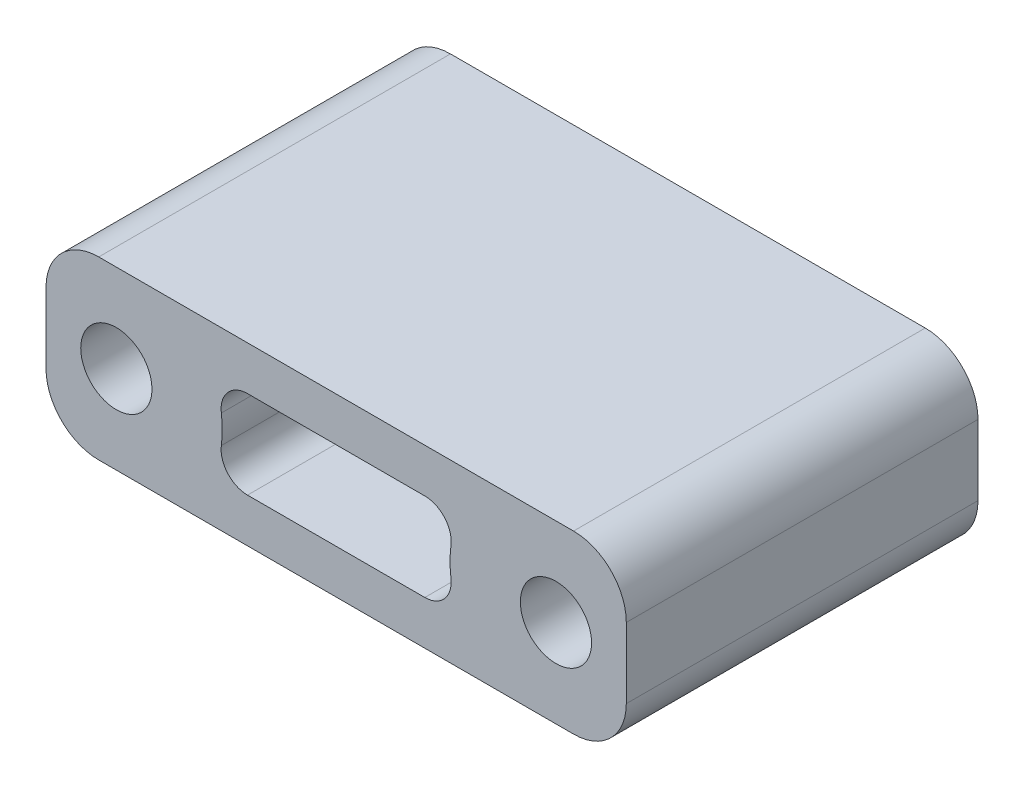
ISO-10303-21;
HEADER;
FILE_DESCRIPTION(('STEP AP214'),'2;1');
FILE_NAME('part.step','',(''),(''),'','','');
FILE_SCHEMA(('AUTOMOTIVE_DESIGN { 1 0 10303 214 1 1 1 1 }'));
ENDSEC;
DATA;
#1=APPLICATION_CONTEXT('core data for automotive mechanical design processes');
#2=APPLICATION_PROTOCOL_DEFINITION('international standard','automotive_design',2000,#1);
#3=PRODUCT_CONTEXT('',#1,'mechanical');
#4=PRODUCT('Part','Part','',(#3));
#5=PRODUCT_RELATED_PRODUCT_CATEGORY('part','',(#4));
#6=PRODUCT_DEFINITION_FORMATION('','',#4);
#7=PRODUCT_DEFINITION_CONTEXT('part definition',#1,'design');
#8=PRODUCT_DEFINITION('design','',#6,#7);
#9=PRODUCT_DEFINITION_SHAPE('','',#8);
#10=(LENGTH_UNIT() NAMED_UNIT(*) SI_UNIT(.MILLI.,.METRE.));
#11=(NAMED_UNIT(*) PLANE_ANGLE_UNIT() SI_UNIT($,.RADIAN.));
#12=(NAMED_UNIT(*) SI_UNIT($,.STERADIAN.) SOLID_ANGLE_UNIT());
#13=UNCERTAINTY_MEASURE_WITH_UNIT(LENGTH_MEASURE(1.E-05),#10,'distance_accuracy_value','');
#14=(GEOMETRIC_REPRESENTATION_CONTEXT(3) GLOBAL_UNCERTAINTY_ASSIGNED_CONTEXT((#13)) GLOBAL_UNIT_ASSIGNED_CONTEXT((#10,
#11,#12)) REPRESENTATION_CONTEXT('',''));
#15=CARTESIAN_POINT('',(0.,0.,0.));
#16=DIRECTION('',(0.,0.,1.));
#17=DIRECTION('',(1.,0.,0.));
#18=AXIS2_PLACEMENT_3D('',#15,#16,#17);
#19=CARTESIAN_POINT('',(0.,0.,10.));
#20=DIRECTION('',(0.,0.,-1.));
#21=DIRECTION('',(-1.,0.,0.));
#22=AXIS2_PLACEMENT_3D('',#19,#20,#21);
#23=PLANE('',#22);
#24=CARTESIAN_POINT('',(12.5,0.,10.));
#25=DIRECTION('',(0.,0.,-1.));
#26=DIRECTION('',(-1.,0.,0.));
#27=AXIS2_PLACEMENT_3D('',#24,#25,#26);
#28=CIRCLE('',#27,6.025);
#29=CARTESIAN_POINT('',(6.52843727022983,0.800664451827247,10.));
#30=VERTEX_POINT('',#29);
#31=CARTESIAN_POINT('',(6.52843727022983,-0.800664451827247,10.));
#32=VERTEX_POINT('',#31);
#33=EDGE_CURVE('E303',#30,#32,#28,.F.);
#34=ORIENTED_EDGE('',*,*,#33,.T.);
#35=CARTESIAN_POINT('',(5.04174115493435,-1.00000000000001,10.));
#36=DIRECTION('',(0.,0.,-1.));
#37=DIRECTION('',(-1.,0.,0.));
#38=AXIS2_PLACEMENT_3D('',#35,#36,#37);
#39=CIRCLE('',#38,1.5);
#40=CARTESIAN_POINT('',(5.04174115493435,-2.50000000000001,10.));
#41=VERTEX_POINT('',#40);
#42=EDGE_CURVE('E273',#32,#41,#39,.T.);
#43=ORIENTED_EDGE('',*,*,#42,.T.);
#44=DIRECTION('',(-1.,0.,0.));
#45=VECTOR('',#44,1.);
#46=CARTESIAN_POINT('',(0.,-2.50000000000001,10.));
#47=LINE('',#46,#45);
#48=CARTESIAN_POINT('',(-5.04174115493435,-2.50000000000001,10.));
#49=VERTEX_POINT('',#48);
#50=EDGE_CURVE('E295',#41,#49,#47,.T.);
#51=ORIENTED_EDGE('',*,*,#50,.T.);
#52=CARTESIAN_POINT('',(-5.04174115493435,-1.00000000000001,10.));
#53=DIRECTION('',(0.,0.,-1.));
#54=DIRECTION('',(-1.,0.,0.));
#55=AXIS2_PLACEMENT_3D('',#52,#53,#54);
#56=CIRCLE('',#55,1.5);
#57=CARTESIAN_POINT('',(-6.52843727022982,-0.80066445182725,10.));
#58=VERTEX_POINT('',#57);
#59=EDGE_CURVE('E277',#49,#58,#56,.T.);
#60=ORIENTED_EDGE('',*,*,#59,.T.);
#61=CARTESIAN_POINT('',(-12.5,0.,10.));
#62=DIRECTION('',(0.,0.,-1.));
#63=DIRECTION('',(-1.,0.,0.));
#64=AXIS2_PLACEMENT_3D('',#61,#62,#63);
#65=CIRCLE('',#64,6.025);
#66=CARTESIAN_POINT('',(-6.52843727022983,0.800664451827245,10.));
#67=VERTEX_POINT('',#66);
#68=EDGE_CURVE('E294',#58,#67,#65,.F.);
#69=ORIENTED_EDGE('',*,*,#68,.T.);
#70=CARTESIAN_POINT('',(-5.04174115493435,1.00000000000001,10.));
#71=DIRECTION('',(0.,0.,-1.));
#72=DIRECTION('',(-1.,0.,0.));
#73=AXIS2_PLACEMENT_3D('',#70,#71,#72);
#74=CIRCLE('',#73,1.5);
#75=CARTESIAN_POINT('',(-5.04174115493435,2.50000000000001,10.));
#76=VERTEX_POINT('',#75);
#77=EDGE_CURVE('E181',#67,#76,#74,.T.);
#78=ORIENTED_EDGE('',*,*,#77,.T.);
#79=DIRECTION('',(1.,0.,0.));
#80=VECTOR('',#79,1.);
#81=CARTESIAN_POINT('',(0.,2.50000000000001,10.));
#82=LINE('',#81,#80);
#83=CARTESIAN_POINT('',(5.04174115493435,2.50000000000001,10.));
#84=VERTEX_POINT('',#83);
#85=EDGE_CURVE('E159',#76,#84,#82,.T.);
#86=ORIENTED_EDGE('',*,*,#85,.T.);
#87=CARTESIAN_POINT('',(5.04174115493435,1.00000000000001,10.));
#88=DIRECTION('',(0.,0.,-1.));
#89=DIRECTION('',(-1.,0.,0.));
#90=AXIS2_PLACEMENT_3D('',#87,#88,#89);
#91=CIRCLE('',#90,1.5);
#92=EDGE_CURVE('E270',#84,#30,#91,.T.);
#93=ORIENTED_EDGE('',*,*,#92,.T.);
#94=EDGE_LOOP('',(#34,#43,#51,#60,#69,#78,#86,#93));
#95=FACE_BOUND('',#94,.T.);
#96=DIRECTION('',(0.,-1.,0.));
#97=VECTOR('',#96,1.);
#98=CARTESIAN_POINT('',(-16.5,-5.,10.));
#99=LINE('',#98,#97);
#100=CARTESIAN_POINT('',(-16.5,2.,10.));
#101=VERTEX_POINT('',#100);
#102=CARTESIAN_POINT('',(-16.5,-2.,10.));
#103=VERTEX_POINT('',#102);
#104=EDGE_CURVE('E315',#101,#103,#99,.T.);
#105=ORIENTED_EDGE('',*,*,#104,.T.);
#106=CARTESIAN_POINT('',(-13.5,-2.,10.));
#107=DIRECTION('',(0.,0.,-1.));
#108=DIRECTION('',(-1.,0.,0.));
#109=AXIS2_PLACEMENT_3D('',#106,#107,#108);
#110=CIRCLE('',#109,3.);
#111=CARTESIAN_POINT('',(-13.5,-5.,10.));
#112=VERTEX_POINT('',#111);
#113=EDGE_CURVE('E209',#103,#112,#110,.F.);
#114=ORIENTED_EDGE('',*,*,#113,.T.);
#115=DIRECTION('',(1.,0.,0.));
#116=VECTOR('',#115,1.);
#117=CARTESIAN_POINT('',(-16.5,-5.,10.));
#118=LINE('',#117,#116);
#119=CARTESIAN_POINT('',(13.5,-4.99999999999999,10.));
#120=VERTEX_POINT('',#119);
#121=EDGE_CURVE('E252',#112,#120,#118,.T.);
#122=ORIENTED_EDGE('',*,*,#121,.T.);
#123=CARTESIAN_POINT('',(13.5,-2.,10.));
#124=DIRECTION('',(0.,0.,-1.));
#125=DIRECTION('',(-1.,0.,0.));
#126=AXIS2_PLACEMENT_3D('',#123,#124,#125);
#127=CIRCLE('',#126,3.);
#128=CARTESIAN_POINT('',(16.5,-2.,10.));
#129=VERTEX_POINT('',#128);
#130=EDGE_CURVE('E205',#120,#129,#127,.F.);
#131=ORIENTED_EDGE('',*,*,#130,.T.);
#132=DIRECTION('',(0.,1.,0.));
#133=VECTOR('',#132,1.);
#134=CARTESIAN_POINT('',(16.5,-4.99999999999999,10.));
#135=LINE('',#134,#133);
#136=CARTESIAN_POINT('',(16.5,2.,10.));
#137=VERTEX_POINT('',#136);
#138=EDGE_CURVE('E219',#129,#137,#135,.T.);
#139=ORIENTED_EDGE('',*,*,#138,.T.);
#140=CARTESIAN_POINT('',(13.5,2.,10.));
#141=DIRECTION('',(0.,0.,-1.));
#142=DIRECTION('',(-1.,0.,0.));
#143=AXIS2_PLACEMENT_3D('',#140,#141,#142);
#144=CIRCLE('',#143,3.);
#145=CARTESIAN_POINT('',(13.5,5.00000000000001,10.));
#146=VERTEX_POINT('',#145);
#147=EDGE_CURVE('E58',#137,#146,#144,.F.);
#148=ORIENTED_EDGE('',*,*,#147,.T.);
#149=DIRECTION('',(-1.,0.,0.));
#150=VECTOR('',#149,1.);
#151=CARTESIAN_POINT('',(-16.5,5.,10.));
#152=LINE('',#151,#150);
#153=CARTESIAN_POINT('',(-13.5,5.,10.));
#154=VERTEX_POINT('',#153);
#155=EDGE_CURVE('E228',#146,#154,#152,.T.);
#156=ORIENTED_EDGE('',*,*,#155,.T.);
#157=CARTESIAN_POINT('',(-13.5,2.,10.));
#158=DIRECTION('',(0.,0.,-1.));
#159=DIRECTION('',(-1.,0.,0.));
#160=AXIS2_PLACEMENT_3D('',#157,#158,#159);
#161=CIRCLE('',#160,3.);
#162=EDGE_CURVE('E207',#154,#101,#161,.F.);
#163=ORIENTED_EDGE('',*,*,#162,.T.);
#164=EDGE_LOOP('',(#105,#114,#122,#131,#139,#148,#156,#163));
#165=FACE_BOUND('',#164,.T.);
#166=CARTESIAN_POINT('',(12.5,0.,10.));
#167=DIRECTION('',(0.,0.,1.));
#168=DIRECTION('',(1.,0.,0.));
#169=AXIS2_PLACEMENT_3D('',#166,#167,#168);
#170=CIRCLE('',#169,2.025);
#171=CARTESIAN_POINT('',(14.525,0.,10.));
#172=VERTEX_POINT('',#171);
#173=EDGE_CURVE('E243',#172,#172,#170,.T.);
#174=ORIENTED_EDGE('',*,*,#173,.F.);
#175=EDGE_LOOP('',(#174));
#176=FACE_BOUND('',#175,.T.);
#177=CARTESIAN_POINT('',(-12.5,0.,10.));
#178=DIRECTION('',(0.,0.,1.));
#179=DIRECTION('',(-1.,0.,0.));
#180=AXIS2_PLACEMENT_3D('',#177,#178,#179);
#181=CIRCLE('',#180,2.025);
#182=CARTESIAN_POINT('',(-14.525,0.,10.));
#183=VERTEX_POINT('',#182);
#184=EDGE_CURVE('E301',#183,#183,#181,.T.);
#185=ORIENTED_EDGE('',*,*,#184,.F.);
#186=EDGE_LOOP('',(#185));
#187=FACE_BOUND('',#186,.T.);
#188=ADVANCED_FACE('F36',(#95,#165,#176,#187),#23,.F.);
#189=CARTESIAN_POINT('',(0.,0.,-10.));
#190=DIRECTION('',(0.,0.,-1.));
#191=DIRECTION('',(-1.,0.,0.));
#192=AXIS2_PLACEMENT_3D('',#189,#190,#191);
#193=PLANE('',#192);
#194=CARTESIAN_POINT('',(-12.5,0.,-10.));
#195=DIRECTION('',(0.,0.,-1.));
#196=DIRECTION('',(-1.,0.,0.));
#197=AXIS2_PLACEMENT_3D('',#194,#195,#196);
#198=CIRCLE('',#197,6.025);
#199=CARTESIAN_POINT('',(-6.52843727022982,-0.80066445182725,-10.));
#200=VERTEX_POINT('',#199);
#201=CARTESIAN_POINT('',(-6.52843727022983,0.800664451827245,-10.));
#202=VERTEX_POINT('',#201);
#203=EDGE_CURVE('E163',#200,#202,#198,.F.);
#204=ORIENTED_EDGE('',*,*,#203,.F.);
#205=CARTESIAN_POINT('',(-5.04174115493435,-1.00000000000001,-10.));
#206=DIRECTION('',(0.,0.,-1.));
#207=DIRECTION('',(-1.,0.,0.));
#208=AXIS2_PLACEMENT_3D('',#205,#206,#207);
#209=CIRCLE('',#208,1.5);
#210=CARTESIAN_POINT('',(-5.04174115493435,-2.50000000000001,-10.));
#211=VERTEX_POINT('',#210);
#212=EDGE_CURVE('E185',#200,#211,#209,.F.);
#213=ORIENTED_EDGE('',*,*,#212,.T.);
#214=DIRECTION('',(-1.,0.,0.));
#215=VECTOR('',#214,1.);
#216=CARTESIAN_POINT('',(0.,-2.50000000000001,-10.));
#217=LINE('',#216,#215);
#218=CARTESIAN_POINT('',(5.04174115493435,-2.50000000000001,-10.));
#219=VERTEX_POINT('',#218);
#220=EDGE_CURVE('E249',#219,#211,#217,.T.);
#221=ORIENTED_EDGE('',*,*,#220,.F.);
#222=CARTESIAN_POINT('',(5.04174115493435,-1.00000000000001,-10.));
#223=DIRECTION('',(0.,0.,-1.));
#224=DIRECTION('',(-1.,0.,0.));
#225=AXIS2_PLACEMENT_3D('',#222,#223,#224);
#226=CIRCLE('',#225,1.5);
#227=CARTESIAN_POINT('',(6.52843727022983,-0.800664451827247,-10.));
#228=VERTEX_POINT('',#227);
#229=EDGE_CURVE('E275',#219,#228,#226,.F.);
#230=ORIENTED_EDGE('',*,*,#229,.T.);
#231=CARTESIAN_POINT('',(12.5,0.,-10.));
#232=DIRECTION('',(0.,0.,-1.));
#233=DIRECTION('',(-1.,0.,0.));
#234=AXIS2_PLACEMENT_3D('',#231,#232,#233);
#235=CIRCLE('',#234,6.025);
#236=CARTESIAN_POINT('',(6.52843727022983,0.800664451827247,-10.));
#237=VERTEX_POINT('',#236);
#238=EDGE_CURVE('E174',#237,#228,#235,.F.);
#239=ORIENTED_EDGE('',*,*,#238,.F.);
#240=CARTESIAN_POINT('',(5.04174115493435,1.00000000000001,-10.));
#241=DIRECTION('',(0.,0.,-1.));
#242=DIRECTION('',(-1.,0.,0.));
#243=AXIS2_PLACEMENT_3D('',#240,#241,#242);
#244=CIRCLE('',#243,1.5);
#245=CARTESIAN_POINT('',(5.04174115493435,2.50000000000001,-10.));
#246=VERTEX_POINT('',#245);
#247=EDGE_CURVE('E173',#237,#246,#244,.F.);
#248=ORIENTED_EDGE('',*,*,#247,.T.);
#249=DIRECTION('',(1.,0.,0.));
#250=VECTOR('',#249,1.);
#251=CARTESIAN_POINT('',(0.,2.50000000000001,-10.));
#252=LINE('',#251,#250);
#253=CARTESIAN_POINT('',(-5.04174115493435,2.50000000000001,-10.));
#254=VERTEX_POINT('',#253);
#255=EDGE_CURVE('E156',#254,#246,#252,.T.);
#256=ORIENTED_EDGE('',*,*,#255,.F.);
#257=CARTESIAN_POINT('',(-5.04174115493435,1.00000000000001,-10.));
#258=DIRECTION('',(0.,0.,-1.));
#259=DIRECTION('',(-1.,0.,0.));
#260=AXIS2_PLACEMENT_3D('',#257,#258,#259);
#261=CIRCLE('',#260,1.5);
#262=EDGE_CURVE('E169',#254,#202,#261,.F.);
#263=ORIENTED_EDGE('',*,*,#262,.T.);
#264=EDGE_LOOP('',(#204,#213,#221,#230,#239,#248,#256,#263));
#265=FACE_BOUND('',#264,.T.);
#266=CARTESIAN_POINT('',(12.5,0.,-10.));
#267=DIRECTION('',(0.,0.,1.));
#268=DIRECTION('',(1.,0.,0.));
#269=AXIS2_PLACEMENT_3D('',#266,#267,#268);
#270=CIRCLE('',#269,2.025);
#271=CARTESIAN_POINT('',(14.525,0.,-10.));
#272=VERTEX_POINT('',#271);
#273=EDGE_CURVE('E308',#272,#272,#270,.T.);
#274=ORIENTED_EDGE('',*,*,#273,.T.);
#275=EDGE_LOOP('',(#274));
#276=FACE_BOUND('',#275,.T.);
#277=DIRECTION('',(1.,0.,0.));
#278=VECTOR('',#277,1.);
#279=CARTESIAN_POINT('',(-16.5,-5.,-10.));
#280=LINE('',#279,#278);
#281=CARTESIAN_POINT('',(-13.5,-5.,-10.));
#282=VERTEX_POINT('',#281);
#283=CARTESIAN_POINT('',(13.5,-4.99999999999999,-10.));
#284=VERTEX_POINT('',#283);
#285=EDGE_CURVE('E229',#282,#284,#280,.T.);
#286=ORIENTED_EDGE('',*,*,#285,.F.);
#287=CARTESIAN_POINT('',(-13.5,-2.,-10.));
#288=DIRECTION('',(0.,0.,-1.));
#289=DIRECTION('',(-1.,0.,0.));
#290=AXIS2_PLACEMENT_3D('',#287,#288,#289);
#291=CIRCLE('',#290,3.);
#292=CARTESIAN_POINT('',(-16.5,-2.,-10.));
#293=VERTEX_POINT('',#292);
#294=EDGE_CURVE('E197',#282,#293,#291,.T.);
#295=ORIENTED_EDGE('',*,*,#294,.T.);
#296=DIRECTION('',(0.,-1.,0.));
#297=VECTOR('',#296,1.);
#298=CARTESIAN_POINT('',(-16.5,-5.,-10.));
#299=LINE('',#298,#297);
#300=CARTESIAN_POINT('',(-16.5,2.,-10.));
#301=VERTEX_POINT('',#300);
#302=EDGE_CURVE('E239',#301,#293,#299,.T.);
#303=ORIENTED_EDGE('',*,*,#302,.F.);
#304=CARTESIAN_POINT('',(-13.5,2.,-10.));
#305=DIRECTION('',(0.,0.,-1.));
#306=DIRECTION('',(-1.,0.,0.));
#307=AXIS2_PLACEMENT_3D('',#304,#305,#306);
#308=CIRCLE('',#307,3.);
#309=CARTESIAN_POINT('',(-13.5,5.,-10.));
#310=VERTEX_POINT('',#309);
#311=EDGE_CURVE('E195',#301,#310,#308,.T.);
#312=ORIENTED_EDGE('',*,*,#311,.T.);
#313=DIRECTION('',(-1.,0.,0.));
#314=VECTOR('',#313,1.);
#315=CARTESIAN_POINT('',(-16.5,5.,-10.));
#316=LINE('',#315,#314);
#317=CARTESIAN_POINT('',(13.5,5.00000000000001,-10.));
#318=VERTEX_POINT('',#317);
#319=EDGE_CURVE('E234',#318,#310,#316,.T.);
#320=ORIENTED_EDGE('',*,*,#319,.F.);
#321=CARTESIAN_POINT('',(13.5,2.,-10.));
#322=DIRECTION('',(0.,0.,-1.));
#323=DIRECTION('',(-1.,0.,0.));
#324=AXIS2_PLACEMENT_3D('',#321,#322,#323);
#325=CIRCLE('',#324,3.);
#326=CARTESIAN_POINT('',(16.5,2.,-10.));
#327=VERTEX_POINT('',#326);
#328=EDGE_CURVE('E191',#318,#327,#325,.T.);
#329=ORIENTED_EDGE('',*,*,#328,.T.);
#330=DIRECTION('',(0.,1.,0.));
#331=VECTOR('',#330,1.);
#332=CARTESIAN_POINT('',(16.5,-4.99999999999999,-10.));
#333=LINE('',#332,#331);
#334=CARTESIAN_POINT('',(16.5,-2.,-10.));
#335=VERTEX_POINT('',#334);
#336=EDGE_CURVE('E222',#335,#327,#333,.T.);
#337=ORIENTED_EDGE('',*,*,#336,.F.);
#338=CARTESIAN_POINT('',(13.5,-2.,-10.));
#339=DIRECTION('',(0.,0.,-1.));
#340=DIRECTION('',(-1.,0.,0.));
#341=AXIS2_PLACEMENT_3D('',#338,#339,#340);
#342=CIRCLE('',#341,3.);
#343=EDGE_CURVE('E193',#335,#284,#342,.T.);
#344=ORIENTED_EDGE('',*,*,#343,.T.);
#345=EDGE_LOOP('',(#286,#295,#303,#312,#320,#329,#337,#344));
#346=FACE_BOUND('',#345,.T.);
#347=CARTESIAN_POINT('',(-12.5,0.,-10.));
#348=DIRECTION('',(0.,0.,1.));
#349=DIRECTION('',(-1.,0.,0.));
#350=AXIS2_PLACEMENT_3D('',#347,#348,#349);
#351=CIRCLE('',#350,2.025);
#352=CARTESIAN_POINT('',(-14.525,0.,-10.));
#353=VERTEX_POINT('',#352);
#354=EDGE_CURVE('E298',#353,#353,#351,.T.);
#355=ORIENTED_EDGE('',*,*,#354,.T.);
#356=EDGE_LOOP('',(#355));
#357=FACE_BOUND('',#356,.T.);
#358=ADVANCED_FACE('F167',(#265,#276,#346,#357),#193,.T.);
#359=CARTESIAN_POINT('',(16.5,-4.99999999999999,10.));
#360=DIRECTION('',(-1.,0.,0.));
#361=DIRECTION('',(0.,-1.,0.));
#362=AXIS2_PLACEMENT_3D('',#359,#360,#361);
#363=PLANE('',#362);
#364=ORIENTED_EDGE('',*,*,#138,.F.);
#365=DIRECTION('',(0.,0.,-1.));
#366=VECTOR('',#365,1.);
#367=CARTESIAN_POINT('',(16.5,-2.,10.));
#368=LINE('',#367,#366);
#369=EDGE_CURVE('E11',#129,#335,#368,.T.);
#370=ORIENTED_EDGE('',*,*,#369,.T.);
#371=ORIENTED_EDGE('',*,*,#336,.T.);
#372=DIRECTION('',(0.,0.,-1.));
#373=VECTOR('',#372,1.);
#374=CARTESIAN_POINT('',(16.5,2.,10.));
#375=LINE('',#374,#373);
#376=EDGE_CURVE('E44',#327,#137,#375,.F.);
#377=ORIENTED_EDGE('',*,*,#376,.T.);
#378=EDGE_LOOP('',(#364,#370,#371,#377));
#379=FACE_BOUND('',#378,.T.);
#380=ADVANCED_FACE('F218',(#379),#363,.F.);
#381=CARTESIAN_POINT('',(-16.5,5.,10.));
#382=DIRECTION('',(0.,-1.,0.));
#383=DIRECTION('',(1.,0.,0.));
#384=AXIS2_PLACEMENT_3D('',#381,#382,#383);
#385=PLANE('',#384);
#386=ORIENTED_EDGE('',*,*,#319,.T.);
#387=DIRECTION('',(0.,0.,-1.));
#388=VECTOR('',#387,1.);
#389=CARTESIAN_POINT('',(-13.5,5.,10.));
#390=LINE('',#389,#388);
#391=EDGE_CURVE('E51',#310,#154,#390,.F.);
#392=ORIENTED_EDGE('',*,*,#391,.T.);
#393=ORIENTED_EDGE('',*,*,#155,.F.);
#394=DIRECTION('',(0.,0.,-1.));
#395=VECTOR('',#394,1.);
#396=CARTESIAN_POINT('',(13.5,5.00000000000001,10.));
#397=LINE('',#396,#395);
#398=EDGE_CURVE('E211',#146,#318,#397,.T.);
#399=ORIENTED_EDGE('',*,*,#398,.T.);
#400=EDGE_LOOP('',(#386,#392,#393,#399));
#401=FACE_BOUND('',#400,.T.);
#402=ADVANCED_FACE('F233',(#401),#385,.F.);
#403=CARTESIAN_POINT('',(-16.5,-5.,10.));
#404=DIRECTION('',(1.,0.,0.));
#405=DIRECTION('',(0.,1.,0.));
#406=AXIS2_PLACEMENT_3D('',#403,#404,#405);
#407=PLANE('',#406);
#408=ORIENTED_EDGE('',*,*,#302,.T.);
#409=DIRECTION('',(0.,0.,-1.));
#410=VECTOR('',#409,1.);
#411=CARTESIAN_POINT('',(-16.5,-2.,10.));
#412=LINE('',#411,#410);
#413=EDGE_CURVE('E202',#293,#103,#412,.F.);
#414=ORIENTED_EDGE('',*,*,#413,.T.);
#415=ORIENTED_EDGE('',*,*,#104,.F.);
#416=DIRECTION('',(0.,0.,-1.));
#417=VECTOR('',#416,1.);
#418=CARTESIAN_POINT('',(-16.5,2.,10.));
#419=LINE('',#418,#417);
#420=EDGE_CURVE('E199',#101,#301,#419,.T.);
#421=ORIENTED_EDGE('',*,*,#420,.T.);
#422=EDGE_LOOP('',(#408,#414,#415,#421));
#423=FACE_BOUND('',#422,.T.);
#424=ADVANCED_FACE('F328',(#423),#407,.F.);
#425=CARTESIAN_POINT('',(-16.5,-5.,10.));
#426=DIRECTION('',(0.,1.,0.));
#427=DIRECTION('',(-1.,0.,0.));
#428=AXIS2_PLACEMENT_3D('',#425,#426,#427);
#429=PLANE('',#428);
#430=ORIENTED_EDGE('',*,*,#121,.F.);
#431=DIRECTION('',(0.,0.,-1.));
#432=VECTOR('',#431,1.);
#433=CARTESIAN_POINT('',(-13.5,-5.,10.));
#434=LINE('',#433,#432);
#435=EDGE_CURVE('E183',#112,#282,#434,.T.);
#436=ORIENTED_EDGE('',*,*,#435,.T.);
#437=ORIENTED_EDGE('',*,*,#285,.T.);
#438=DIRECTION('',(0.,0.,-1.));
#439=VECTOR('',#438,1.);
#440=CARTESIAN_POINT('',(13.5,-4.99999999999999,10.));
#441=LINE('',#440,#439);
#442=EDGE_CURVE('E180',#284,#120,#441,.F.);
#443=ORIENTED_EDGE('',*,*,#442,.T.);
#444=EDGE_LOOP('',(#430,#436,#437,#443));
#445=FACE_BOUND('',#444,.T.);
#446=ADVANCED_FACE('F323',(#445),#429,.F.);
#447=CARTESIAN_POINT('',(12.5,0.,10.));
#448=DIRECTION('',(0.,0.,-1.));
#449=DIRECTION('',(-1.,0.,0.));
#450=AXIS2_PLACEMENT_3D('',#447,#448,#449);
#451=CYLINDRICAL_SURFACE('',#450,2.025);
#452=ORIENTED_EDGE('',*,*,#173,.T.);
#453=EDGE_LOOP('',(#452));
#454=FACE_BOUND('',#453,.T.);
#455=ORIENTED_EDGE('',*,*,#273,.F.);
#456=EDGE_LOOP('',(#455));
#457=FACE_BOUND('',#456,.T.);
#458=ADVANCED_FACE('F348',(#454,#457),#451,.F.);
#459=CARTESIAN_POINT('',(-12.5,0.,10.));
#460=DIRECTION('',(0.,0.,-1.));
#461=DIRECTION('',(-1.,0.,0.));
#462=AXIS2_PLACEMENT_3D('',#459,#460,#461);
#463=CYLINDRICAL_SURFACE('',#462,2.025);
#464=ORIENTED_EDGE('',*,*,#184,.T.);
#465=EDGE_LOOP('',(#464));
#466=FACE_BOUND('',#465,.T.);
#467=ORIENTED_EDGE('',*,*,#354,.F.);
#468=EDGE_LOOP('',(#467));
#469=FACE_BOUND('',#468,.T.);
#470=ADVANCED_FACE('F438',(#466,#469),#463,.F.);
#471=CARTESIAN_POINT('',(-12.5,0.,-15.));
#472=DIRECTION('',(0.,0.,1.));
#473=DIRECTION('',(1.,0.,0.));
#474=AXIS2_PLACEMENT_3D('',#471,#472,#473);
#475=CYLINDRICAL_SURFACE('',#474,6.025);
#476=ORIENTED_EDGE('',*,*,#68,.F.);
#477=DIRECTION('',(0.,0.,1.));
#478=VECTOR('',#477,1.);
#479=CARTESIAN_POINT('',(-6.52843727022982,-0.80066445182725,-15.));
#480=LINE('',#479,#478);
#481=EDGE_CURVE('E268',#58,#200,#480,.F.);
#482=ORIENTED_EDGE('',*,*,#481,.T.);
#483=ORIENTED_EDGE('',*,*,#203,.T.);
#484=DIRECTION('',(0.,0.,1.));
#485=VECTOR('',#484,1.);
#486=CARTESIAN_POINT('',(-6.52843727022983,0.800664451827245,-15.));
#487=LINE('',#486,#485);
#488=EDGE_CURVE('E179',#202,#67,#487,.T.);
#489=ORIENTED_EDGE('',*,*,#488,.T.);
#490=EDGE_LOOP('',(#476,#482,#483,#489));
#491=FACE_BOUND('',#490,.T.);
#492=ADVANCED_FACE('F297',(#491),#475,.T.);
#493=CARTESIAN_POINT('',(-7.01815496388305,2.50000000000001,-15.));
#494=DIRECTION('',(0.,1.,0.));
#495=DIRECTION('',(-1.,0.,0.));
#496=AXIS2_PLACEMENT_3D('',#493,#494,#495);
#497=PLANE('',#496);
#498=ORIENTED_EDGE('',*,*,#255,.T.);
#499=DIRECTION('',(0.,0.,-1.));
#500=VECTOR('',#499,1.);
#501=CARTESIAN_POINT('',(5.04174115493435,2.5,10.));
#502=LINE('',#501,#500);
#503=EDGE_CURVE('E162',#246,#84,#502,.F.);
#504=ORIENTED_EDGE('',*,*,#503,.T.);
#505=ORIENTED_EDGE('',*,*,#85,.F.);
#506=DIRECTION('',(0.,0.,-1.));
#507=VECTOR('',#506,1.);
#508=CARTESIAN_POINT('',(-5.04174115493435,2.50000000000001,-10.));
#509=LINE('',#508,#507);
#510=EDGE_CURVE('E152',#76,#254,#509,.T.);
#511=ORIENTED_EDGE('',*,*,#510,.T.);
#512=EDGE_LOOP('',(#498,#504,#505,#511));
#513=FACE_BOUND('',#512,.T.);
#514=ADVANCED_FACE('F154',(#513),#497,.F.);
#515=CARTESIAN_POINT('',(12.5,0.,-15.));
#516=DIRECTION('',(0.,0.,1.));
#517=DIRECTION('',(1.,0.,0.));
#518=AXIS2_PLACEMENT_3D('',#515,#516,#517);
#519=CYLINDRICAL_SURFACE('',#518,6.025);
#520=ORIENTED_EDGE('',*,*,#33,.F.);
#521=DIRECTION('',(0.,0.,1.));
#522=VECTOR('',#521,1.);
#523=CARTESIAN_POINT('',(6.52843727022983,0.800664451827247,-15.));
#524=LINE('',#523,#522);
#525=EDGE_CURVE('E260',#30,#237,#524,.F.);
#526=ORIENTED_EDGE('',*,*,#525,.T.);
#527=ORIENTED_EDGE('',*,*,#238,.T.);
#528=DIRECTION('',(0.,0.,1.));
#529=VECTOR('',#528,1.);
#530=CARTESIAN_POINT('',(6.52843727022983,-0.800664451827247,-15.));
#531=LINE('',#530,#529);
#532=EDGE_CURVE('E257',#228,#32,#531,.T.);
#533=ORIENTED_EDGE('',*,*,#532,.T.);
#534=EDGE_LOOP('',(#520,#526,#527,#533));
#535=FACE_BOUND('',#534,.T.);
#536=ADVANCED_FACE('F456',(#535),#519,.T.);
#537=CARTESIAN_POINT('',(-7.01815496388305,-2.50000000000001,-15.));
#538=DIRECTION('',(0.,-1.,0.));
#539=DIRECTION('',(1.,0.,0.));
#540=AXIS2_PLACEMENT_3D('',#537,#538,#539);
#541=PLANE('',#540);
#542=ORIENTED_EDGE('',*,*,#50,.F.);
#543=DIRECTION('',(0.,0.,-1.));
#544=VECTOR('',#543,1.);
#545=CARTESIAN_POINT('',(5.04174115493435,-2.5,-10.));
#546=LINE('',#545,#544);
#547=EDGE_CURVE('E265',#41,#219,#546,.T.);
#548=ORIENTED_EDGE('',*,*,#547,.T.);
#549=ORIENTED_EDGE('',*,*,#220,.T.);
#550=DIRECTION('',(0.,0.,-1.));
#551=VECTOR('',#550,1.);
#552=CARTESIAN_POINT('',(-5.04174115493435,-2.50000000000001,10.));
#553=LINE('',#552,#551);
#554=EDGE_CURVE('E262',#211,#49,#553,.F.);
#555=ORIENTED_EDGE('',*,*,#554,.T.);
#556=EDGE_LOOP('',(#542,#548,#549,#555));
#557=FACE_BOUND('',#556,.T.);
#558=ADVANCED_FACE('F286',(#557),#541,.F.);
#559=CARTESIAN_POINT('',(5.04174115493435,1.00000000000001,-15.));
#560=DIRECTION('',(0.,0.,1.));
#561=DIRECTION('',(1.,0.,0.));
#562=AXIS2_PLACEMENT_3D('',#559,#560,#561);
#563=CYLINDRICAL_SURFACE('',#562,1.5);
#564=ORIENTED_EDGE('',*,*,#247,.F.);
#565=ORIENTED_EDGE('',*,*,#525,.F.);
#566=ORIENTED_EDGE('',*,*,#92,.F.);
#567=ORIENTED_EDGE('',*,*,#503,.F.);
#568=EDGE_LOOP('',(#564,#565,#566,#567));
#569=FACE_BOUND('',#568,.T.);
#570=ADVANCED_FACE('F359',(#569),#563,.F.);
#571=CARTESIAN_POINT('',(5.04174115493435,-1.00000000000001,-15.));
#572=DIRECTION('',(0.,0.,1.));
#573=DIRECTION('',(1.,0.,0.));
#574=AXIS2_PLACEMENT_3D('',#571,#572,#573);
#575=CYLINDRICAL_SURFACE('',#574,1.5);
#576=ORIENTED_EDGE('',*,*,#229,.F.);
#577=ORIENTED_EDGE('',*,*,#547,.F.);
#578=ORIENTED_EDGE('',*,*,#42,.F.);
#579=ORIENTED_EDGE('',*,*,#532,.F.);
#580=EDGE_LOOP('',(#576,#577,#578,#579));
#581=FACE_BOUND('',#580,.T.);
#582=ADVANCED_FACE('F362',(#581),#575,.F.);
#583=CARTESIAN_POINT('',(-5.04174115493435,-1.00000000000001,-15.));
#584=DIRECTION('',(0.,0.,1.));
#585=DIRECTION('',(1.,0.,0.));
#586=AXIS2_PLACEMENT_3D('',#583,#584,#585);
#587=CYLINDRICAL_SURFACE('',#586,1.5);
#588=ORIENTED_EDGE('',*,*,#212,.F.);
#589=ORIENTED_EDGE('',*,*,#481,.F.);
#590=ORIENTED_EDGE('',*,*,#59,.F.);
#591=ORIENTED_EDGE('',*,*,#554,.F.);
#592=EDGE_LOOP('',(#588,#589,#590,#591));
#593=FACE_BOUND('',#592,.T.);
#594=ADVANCED_FACE('F289',(#593),#587,.F.);
#595=CARTESIAN_POINT('',(-5.04174115493435,1.00000000000001,-15.));
#596=DIRECTION('',(0.,0.,1.));
#597=DIRECTION('',(1.,0.,0.));
#598=AXIS2_PLACEMENT_3D('',#595,#596,#597);
#599=CYLINDRICAL_SURFACE('',#598,1.5);
#600=ORIENTED_EDGE('',*,*,#262,.F.);
#601=ORIENTED_EDGE('',*,*,#510,.F.);
#602=ORIENTED_EDGE('',*,*,#77,.F.);
#603=ORIENTED_EDGE('',*,*,#488,.F.);
#604=EDGE_LOOP('',(#600,#601,#602,#603));
#605=FACE_BOUND('',#604,.T.);
#606=ADVANCED_FACE('F177',(#605),#599,.F.);
#607=CARTESIAN_POINT('',(-13.5,-2.,10.));
#608=DIRECTION('',(0.,0.,-1.));
#609=DIRECTION('',(-1.,0.,0.));
#610=AXIS2_PLACEMENT_3D('',#607,#608,#609);
#611=CYLINDRICAL_SURFACE('',#610,3.);
#612=ORIENTED_EDGE('',*,*,#113,.F.);
#613=ORIENTED_EDGE('',*,*,#413,.F.);
#614=ORIENTED_EDGE('',*,*,#294,.F.);
#615=ORIENTED_EDGE('',*,*,#435,.F.);
#616=EDGE_LOOP('',(#612,#613,#614,#615));
#617=FACE_BOUND('',#616,.T.);
#618=ADVANCED_FACE('F325',(#617),#611,.T.);
#619=CARTESIAN_POINT('',(-13.5,2.,10.));
#620=DIRECTION('',(0.,0.,-1.));
#621=DIRECTION('',(-1.,0.,0.));
#622=AXIS2_PLACEMENT_3D('',#619,#620,#621);
#623=CYLINDRICAL_SURFACE('',#622,3.);
#624=ORIENTED_EDGE('',*,*,#162,.F.);
#625=ORIENTED_EDGE('',*,*,#391,.F.);
#626=ORIENTED_EDGE('',*,*,#311,.F.);
#627=ORIENTED_EDGE('',*,*,#420,.F.);
#628=EDGE_LOOP('',(#624,#625,#626,#627));
#629=FACE_BOUND('',#628,.T.);
#630=ADVANCED_FACE('F333',(#629),#623,.T.);
#631=CARTESIAN_POINT('',(13.5,-2.,10.));
#632=DIRECTION('',(0.,0.,-1.));
#633=DIRECTION('',(-1.,0.,0.));
#634=AXIS2_PLACEMENT_3D('',#631,#632,#633);
#635=CYLINDRICAL_SURFACE('',#634,3.);
#636=ORIENTED_EDGE('',*,*,#130,.F.);
#637=ORIENTED_EDGE('',*,*,#442,.F.);
#638=ORIENTED_EDGE('',*,*,#343,.F.);
#639=ORIENTED_EDGE('',*,*,#369,.F.);
#640=EDGE_LOOP('',(#636,#637,#638,#639));
#641=FACE_BOUND('',#640,.T.);
#642=ADVANCED_FACE('F322',(#641),#635,.T.);
#643=CARTESIAN_POINT('',(13.5,2.,10.));
#644=DIRECTION('',(0.,0.,-1.));
#645=DIRECTION('',(-1.,0.,0.));
#646=AXIS2_PLACEMENT_3D('',#643,#644,#645);
#647=CYLINDRICAL_SURFACE('',#646,3.);
#648=ORIENTED_EDGE('',*,*,#147,.F.);
#649=ORIENTED_EDGE('',*,*,#376,.F.);
#650=ORIENTED_EDGE('',*,*,#328,.F.);
#651=ORIENTED_EDGE('',*,*,#398,.F.);
#652=EDGE_LOOP('',(#648,#649,#650,#651));
#653=FACE_BOUND('',#652,.T.);
#654=ADVANCED_FACE('F38',(#653),#647,.T.);
#655=CLOSED_SHELL('',(#188,#358,#380,#402,#424,#446,#458,#470,#492,#514,#536,#558,#570,#582,
#594,#606,#618,#630,#642,#654));
#656=MANIFOLD_SOLID_BREP('B2',#655);
#657=ADVANCED_BREP_SHAPE_REPRESENTATION('',(#18,#656),#14);
#658=SHAPE_DEFINITION_REPRESENTATION(#9,#657);
ENDSEC;
END-ISO-10303-21;
